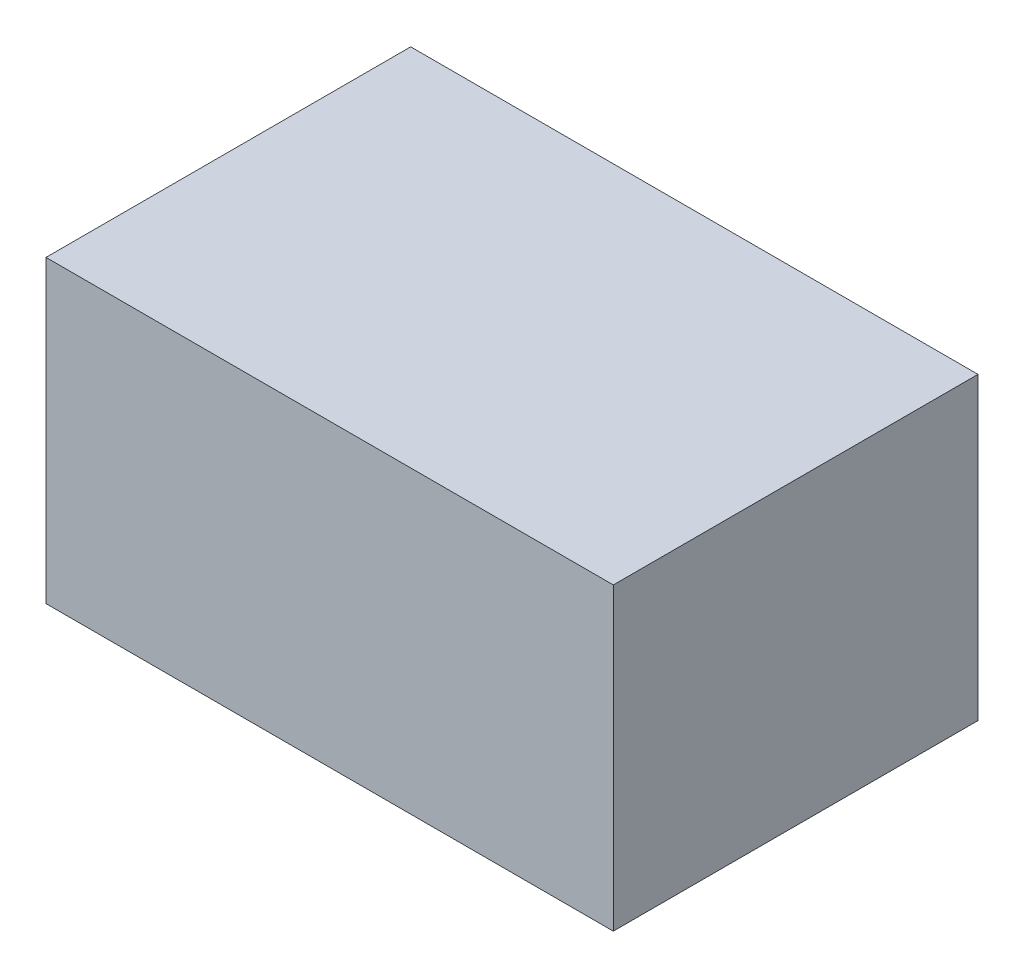
ISO-10303-21;
HEADER;
FILE_DESCRIPTION(('STEP AP214'),'2;1');
FILE_NAME('part.step','',(''),(''),'','','');
FILE_SCHEMA(('AUTOMOTIVE_DESIGN { 1 0 10303 214 1 1 1 1 }'));
ENDSEC;
DATA;
#1=APPLICATION_CONTEXT('core data for automotive mechanical design processes');
#2=APPLICATION_PROTOCOL_DEFINITION('international standard','automotive_design',2000,#1);
#3=PRODUCT_CONTEXT('',#1,'mechanical');
#4=PRODUCT('Part','Part','',(#3));
#5=PRODUCT_RELATED_PRODUCT_CATEGORY('part','',(#4));
#6=PRODUCT_DEFINITION_FORMATION('','',#4);
#7=PRODUCT_DEFINITION_CONTEXT('part definition',#1,'design');
#8=PRODUCT_DEFINITION('design','',#6,#7);
#9=PRODUCT_DEFINITION_SHAPE('','',#8);
#10=(LENGTH_UNIT() NAMED_UNIT(*) SI_UNIT(.MILLI.,.METRE.));
#11=(NAMED_UNIT(*) PLANE_ANGLE_UNIT() SI_UNIT($,.RADIAN.));
#12=(NAMED_UNIT(*) SI_UNIT($,.STERADIAN.) SOLID_ANGLE_UNIT());
#13=UNCERTAINTY_MEASURE_WITH_UNIT(LENGTH_MEASURE(1.E-05),#10,'distance_accuracy_value','');
#14=(GEOMETRIC_REPRESENTATION_CONTEXT(3) GLOBAL_UNCERTAINTY_ASSIGNED_CONTEXT((#13)) GLOBAL_UNIT_ASSIGNED_CONTEXT((#10,
#11,#12)) REPRESENTATION_CONTEXT('',''));
#15=CARTESIAN_POINT('',(0.,0.,0.));
#16=DIRECTION('',(0.,0.,1.));
#17=DIRECTION('',(1.,0.,0.));
#18=AXIS2_PLACEMENT_3D('',#15,#16,#17);
#19=CARTESIAN_POINT('',(0.,3.7,0.));
#20=DIRECTION('',(1.,0.,0.));
#21=DIRECTION('',(0.,0.,-1.));
#22=AXIS2_PLACEMENT_3D('',#19,#20,#21);
#23=PLANE('',#22);
#24=DIRECTION('',(0.,0.,1.));
#25=VECTOR('',#24,1.);
#26=CARTESIAN_POINT('',(0.,0.,0.));
#27=LINE('',#26,#25);
#28=CARTESIAN_POINT('',(0.,0.,-4.5));
#29=VERTEX_POINT('',#28);
#30=CARTESIAN_POINT('',(0.,0.,0.));
#31=VERTEX_POINT('',#30);
#32=EDGE_CURVE('E107',#29,#31,#27,.T.);
#33=ORIENTED_EDGE('',*,*,#32,.T.);
#34=DIRECTION('',(0.,-1.,0.));
#35=VECTOR('',#34,1.);
#36=CARTESIAN_POINT('',(0.,3.7,0.));
#37=LINE('',#36,#35);
#38=CARTESIAN_POINT('',(0.,3.7,0.));
#39=VERTEX_POINT('',#38);
#40=EDGE_CURVE('E11',#39,#31,#37,.T.);
#41=ORIENTED_EDGE('',*,*,#40,.F.);
#42=DIRECTION('',(0.,0.,1.));
#43=VECTOR('',#42,1.);
#44=CARTESIAN_POINT('',(0.,3.7,0.));
#45=LINE('',#44,#43);
#46=CARTESIAN_POINT('',(0.,3.7,-4.5));
#47=VERTEX_POINT('',#46);
#48=EDGE_CURVE('E91',#47,#39,#45,.T.);
#49=ORIENTED_EDGE('',*,*,#48,.F.);
#50=DIRECTION('',(0.,-1.,0.));
#51=VECTOR('',#50,1.);
#52=CARTESIAN_POINT('',(0.,3.7,-4.5));
#53=LINE('',#52,#51);
#54=EDGE_CURVE('E103',#47,#29,#53,.T.);
#55=ORIENTED_EDGE('',*,*,#54,.T.);
#56=EDGE_LOOP('',(#33,#41,#49,#55));
#57=FACE_BOUND('',#56,.T.);
#58=ADVANCED_FACE('F39',(#57),#23,.F.);
#59=CARTESIAN_POINT('',(0.,3.7,0.));
#60=DIRECTION('',(0.,0.,-1.));
#61=DIRECTION('',(-1.,0.,0.));
#62=AXIS2_PLACEMENT_3D('',#59,#60,#61);
#63=PLANE('',#62);
#64=DIRECTION('',(1.,0.,0.));
#65=VECTOR('',#64,1.);
#66=CARTESIAN_POINT('',(0.,0.,0.));
#67=LINE('',#66,#65);
#68=CARTESIAN_POINT('',(7.,0.,0.));
#69=VERTEX_POINT('',#68);
#70=EDGE_CURVE('E96',#31,#69,#67,.T.);
#71=ORIENTED_EDGE('',*,*,#70,.T.);
#72=DIRECTION('',(0.,-1.,0.));
#73=VECTOR('',#72,1.);
#74=CARTESIAN_POINT('',(7.,3.7,0.));
#75=LINE('',#74,#73);
#76=CARTESIAN_POINT('',(7.,3.7,0.));
#77=VERTEX_POINT('',#76);
#78=EDGE_CURVE('E48',#77,#69,#75,.T.);
#79=ORIENTED_EDGE('',*,*,#78,.F.);
#80=DIRECTION('',(1.,0.,0.));
#81=VECTOR('',#80,1.);
#82=CARTESIAN_POINT('',(0.,3.7,0.));
#83=LINE('',#82,#81);
#84=EDGE_CURVE('E86',#39,#77,#83,.T.);
#85=ORIENTED_EDGE('',*,*,#84,.F.);
#86=ORIENTED_EDGE('',*,*,#40,.T.);
#87=EDGE_LOOP('',(#71,#79,#85,#86));
#88=FACE_BOUND('',#87,.T.);
#89=ADVANCED_FACE('F95',(#88),#63,.F.);
#90=CARTESIAN_POINT('',(7.,3.7,0.));
#91=DIRECTION('',(-1.,0.,0.));
#92=DIRECTION('',(0.,0.,1.));
#93=AXIS2_PLACEMENT_3D('',#90,#91,#92);
#94=PLANE('',#93);
#95=DIRECTION('',(0.,0.,-1.));
#96=VECTOR('',#95,1.);
#97=CARTESIAN_POINT('',(7.,0.,0.));
#98=LINE('',#97,#96);
#99=CARTESIAN_POINT('',(7.,0.,-4.5));
#100=VERTEX_POINT('',#99);
#101=EDGE_CURVE('E73',#69,#100,#98,.T.);
#102=ORIENTED_EDGE('',*,*,#101,.T.);
#103=DIRECTION('',(0.,-1.,0.));
#104=VECTOR('',#103,1.);
#105=CARTESIAN_POINT('',(7.,3.7,-4.5));
#106=LINE('',#105,#104);
#107=CARTESIAN_POINT('',(7.,3.7,-4.5));
#108=VERTEX_POINT('',#107);
#109=EDGE_CURVE('E98',#108,#100,#106,.T.);
#110=ORIENTED_EDGE('',*,*,#109,.F.);
#111=DIRECTION('',(0.,0.,-1.));
#112=VECTOR('',#111,1.);
#113=CARTESIAN_POINT('',(7.,3.7,0.));
#114=LINE('',#113,#112);
#115=EDGE_CURVE('E89',#77,#108,#114,.T.);
#116=ORIENTED_EDGE('',*,*,#115,.F.);
#117=ORIENTED_EDGE('',*,*,#78,.T.);
#118=EDGE_LOOP('',(#102,#110,#116,#117));
#119=FACE_BOUND('',#118,.T.);
#120=ADVANCED_FACE('F99',(#119),#94,.F.);
#121=CARTESIAN_POINT('',(0.,3.7,-4.5));
#122=DIRECTION('',(0.,0.,1.));
#123=DIRECTION('',(1.,0.,0.));
#124=AXIS2_PLACEMENT_3D('',#121,#122,#123);
#125=PLANE('',#124);
#126=DIRECTION('',(-1.,0.,0.));
#127=VECTOR('',#126,1.);
#128=CARTESIAN_POINT('',(0.,0.,-4.5));
#129=LINE('',#128,#127);
#130=EDGE_CURVE('E79',#100,#29,#129,.T.);
#131=ORIENTED_EDGE('',*,*,#130,.T.);
#132=ORIENTED_EDGE('',*,*,#54,.F.);
#133=DIRECTION('',(-1.,0.,0.));
#134=VECTOR('',#133,1.);
#135=CARTESIAN_POINT('',(0.,3.7,-4.5));
#136=LINE('',#135,#134);
#137=EDGE_CURVE('E56',#108,#47,#136,.T.);
#138=ORIENTED_EDGE('',*,*,#137,.F.);
#139=ORIENTED_EDGE('',*,*,#109,.T.);
#140=EDGE_LOOP('',(#131,#132,#138,#139));
#141=FACE_BOUND('',#140,.T.);
#142=ADVANCED_FACE('F120',(#141),#125,.F.);
#143=CARTESIAN_POINT('',(0.,3.7,0.));
#144=DIRECTION('',(0.,-1.,0.));
#145=DIRECTION('',(0.,0.,-1.));
#146=AXIS2_PLACEMENT_3D('',#143,#144,#145);
#147=PLANE('',#146);
#148=ORIENTED_EDGE('',*,*,#48,.T.);
#149=ORIENTED_EDGE('',*,*,#84,.T.);
#150=ORIENTED_EDGE('',*,*,#115,.T.);
#151=ORIENTED_EDGE('',*,*,#137,.T.);
#152=EDGE_LOOP('',(#148,#149,#150,#151));
#153=FACE_BOUND('',#152,.T.);
#154=ADVANCED_FACE('F87',(#153),#147,.F.);
#155=CARTESIAN_POINT('',(0.,0.,0.));
#156=DIRECTION('',(0.,-1.,0.));
#157=DIRECTION('',(0.,0.,-1.));
#158=AXIS2_PLACEMENT_3D('',#155,#156,#157);
#159=PLANE('',#158);
#160=ORIENTED_EDGE('',*,*,#32,.F.);
#161=ORIENTED_EDGE('',*,*,#130,.F.);
#162=ORIENTED_EDGE('',*,*,#101,.F.);
#163=ORIENTED_EDGE('',*,*,#70,.F.);
#164=EDGE_LOOP('',(#160,#161,#162,#163));
#165=FACE_BOUND('',#164,.T.);
#166=ADVANCED_FACE('F123',(#165),#159,.T.);
#167=CLOSED_SHELL('',(#58,#89,#120,#142,#154,#166));
#168=MANIFOLD_SOLID_BREP('B2',#167);
#169=ADVANCED_BREP_SHAPE_REPRESENTATION('',(#18,#168),#14);
#170=SHAPE_DEFINITION_REPRESENTATION(#9,#169);
ENDSEC;
END-ISO-10303-21;
